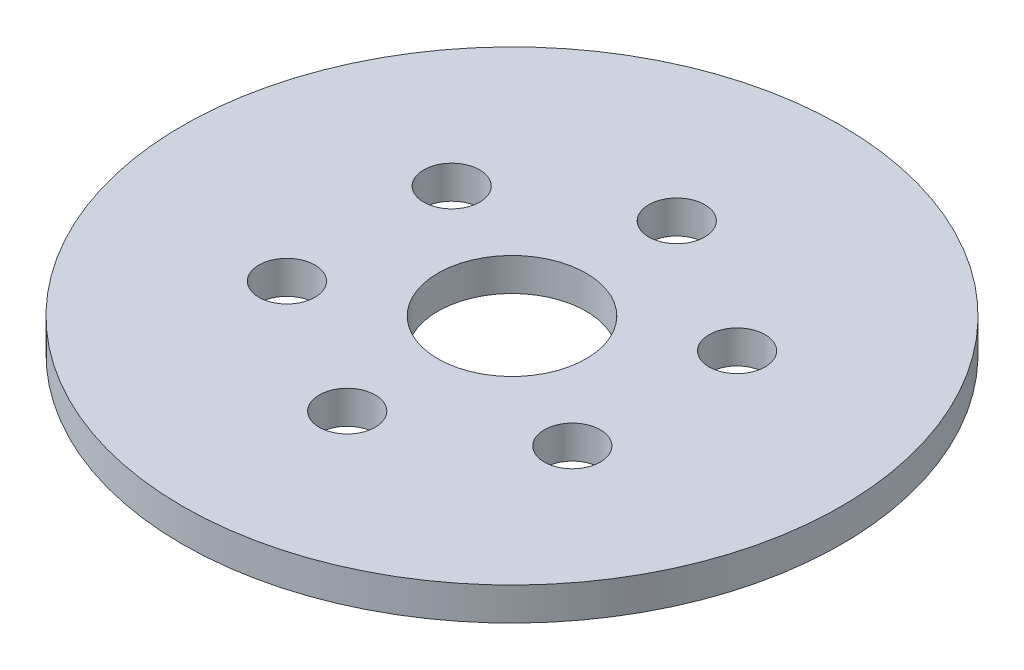
ISO-10303-21;
HEADER;
FILE_DESCRIPTION(('STEP AP214'),'2;1');
FILE_NAME('part.step','',(''),(''),'','','');
FILE_SCHEMA(('AUTOMOTIVE_DESIGN { 1 0 10303 214 1 1 1 1 }'));
ENDSEC;
DATA;
#1=APPLICATION_CONTEXT('core data for automotive mechanical design processes');
#2=APPLICATION_PROTOCOL_DEFINITION('international standard','automotive_design',2000,#1);
#3=PRODUCT_CONTEXT('',#1,'mechanical');
#4=PRODUCT('Part','Part','',(#3));
#5=PRODUCT_RELATED_PRODUCT_CATEGORY('part','',(#4));
#6=PRODUCT_DEFINITION_FORMATION('','',#4);
#7=PRODUCT_DEFINITION_CONTEXT('part definition',#1,'design');
#8=PRODUCT_DEFINITION('design','',#6,#7);
#9=PRODUCT_DEFINITION_SHAPE('','',#8);
#10=(LENGTH_UNIT() NAMED_UNIT(*) SI_UNIT(.MILLI.,.METRE.));
#11=(NAMED_UNIT(*) PLANE_ANGLE_UNIT() SI_UNIT($,.RADIAN.));
#12=(NAMED_UNIT(*) SI_UNIT($,.STERADIAN.) SOLID_ANGLE_UNIT());
#13=UNCERTAINTY_MEASURE_WITH_UNIT(LENGTH_MEASURE(1.E-05),#10,'distance_accuracy_value','');
#14=(GEOMETRIC_REPRESENTATION_CONTEXT(3) GLOBAL_UNCERTAINTY_ASSIGNED_CONTEXT((#13)) GLOBAL_UNIT_ASSIGNED_CONTEXT((#10,
#11,#12)) REPRESENTATION_CONTEXT('',''));
#15=CARTESIAN_POINT('',(0.,0.,0.));
#16=DIRECTION('',(0.,0.,1.));
#17=DIRECTION('',(1.,0.,0.));
#18=AXIS2_PLACEMENT_3D('',#15,#16,#17);
#19=CARTESIAN_POINT('',(0.,2.,0.));
#20=DIRECTION('',(0.,1.,0.));
#21=DIRECTION('',(0.,0.,1.));
#22=AXIS2_PLACEMENT_3D('',#19,#20,#21);
#23=PLANE('',#22);
#24=CARTESIAN_POINT('',(0.,2.,-10.));
#25=DIRECTION('',(0.,1.,0.));
#26=DIRECTION('',(0.,0.,1.));
#27=AXIS2_PLACEMENT_3D('',#24,#25,#26);
#28=CIRCLE('',#27,1.7);
#29=CARTESIAN_POINT('',(0.,2.,-8.3));
#30=VERTEX_POINT('',#29);
#31=EDGE_CURVE('E76',#30,#30,#28,.T.);
#32=ORIENTED_EDGE('',*,*,#31,.F.);
#33=EDGE_LOOP('',(#32));
#34=FACE_BOUND('',#33,.T.);
#35=CARTESIAN_POINT('',(-8.66025403784433,2.,-5.0000000000001));
#36=DIRECTION('',(0.,1.,0.));
#37=DIRECTION('',(0.,0.,1.));
#38=AXIS2_PLACEMENT_3D('',#35,#36,#37);
#39=CIRCLE('',#38,1.7);
#40=CARTESIAN_POINT('',(-8.66025403784433,2.,-3.3000000000001));
#41=VERTEX_POINT('',#40);
#42=EDGE_CURVE('E77',#41,#41,#39,.T.);
#43=ORIENTED_EDGE('',*,*,#42,.F.);
#44=EDGE_LOOP('',(#43));
#45=FACE_BOUND('',#44,.T.);
#46=CARTESIAN_POINT('',(-8.66025403784443,2.,4.99999999999992));
#47=DIRECTION('',(0.,1.,0.));
#48=DIRECTION('',(0.,0.,1.));
#49=AXIS2_PLACEMENT_3D('',#46,#47,#48);
#50=CIRCLE('',#49,1.7);
#51=CARTESIAN_POINT('',(-8.66025403784443,2.,6.69999999999992));
#52=VERTEX_POINT('',#51);
#53=EDGE_CURVE('E51',#52,#52,#50,.T.);
#54=ORIENTED_EDGE('',*,*,#53,.F.);
#55=EDGE_LOOP('',(#54));
#56=FACE_BOUND('',#55,.T.);
#57=CARTESIAN_POINT('',(0.,2.,10.));
#58=DIRECTION('',(0.,1.,0.));
#59=DIRECTION('',(0.,0.,1.));
#60=AXIS2_PLACEMENT_3D('',#57,#58,#59);
#61=CIRCLE('',#60,1.7);
#62=CARTESIAN_POINT('',(0.,2.,11.7));
#63=VERTEX_POINT('',#62);
#64=EDGE_CURVE('E58',#63,#63,#61,.T.);
#65=ORIENTED_EDGE('',*,*,#64,.F.);
#66=EDGE_LOOP('',(#65));
#67=FACE_BOUND('',#66,.T.);
#68=CARTESIAN_POINT('',(8.66025403784437,2.,5.00000000000004));
#69=DIRECTION('',(0.,1.,0.));
#70=DIRECTION('',(0.,0.,1.));
#71=AXIS2_PLACEMENT_3D('',#68,#69,#70);
#72=CIRCLE('',#71,1.7);
#73=CARTESIAN_POINT('',(8.66025403784437,2.,6.70000000000004));
#74=VERTEX_POINT('',#73);
#75=EDGE_CURVE('E64',#74,#74,#72,.T.);
#76=ORIENTED_EDGE('',*,*,#75,.F.);
#77=EDGE_LOOP('',(#76));
#78=FACE_BOUND('',#77,.T.);
#79=CARTESIAN_POINT('',(8.6602540378444,2.,-4.99999999999998));
#80=DIRECTION('',(0.,1.,0.));
#81=DIRECTION('',(0.,0.,1.));
#82=AXIS2_PLACEMENT_3D('',#79,#80,#81);
#83=CIRCLE('',#82,1.7);
#84=CARTESIAN_POINT('',(8.6602540378444,2.,-3.29999999999998));
#85=VERTEX_POINT('',#84);
#86=EDGE_CURVE('E70',#85,#85,#83,.T.);
#87=ORIENTED_EDGE('',*,*,#86,.F.);
#88=EDGE_LOOP('',(#87));
#89=FACE_BOUND('',#88,.T.);
#90=CARTESIAN_POINT('',(0.,2.,0.));
#91=DIRECTION('',(0.,1.,0.));
#92=DIRECTION('',(0.,0.,1.));
#93=AXIS2_PLACEMENT_3D('',#90,#91,#92);
#94=CIRCLE('',#93,20.);
#95=CARTESIAN_POINT('',(0.,2.,20.));
#96=VERTEX_POINT('',#95);
#97=EDGE_CURVE('E10',#96,#96,#94,.T.);
#98=ORIENTED_EDGE('',*,*,#97,.T.);
#99=EDGE_LOOP('',(#98));
#100=FACE_BOUND('',#99,.T.);
#101=CARTESIAN_POINT('',(0.,2.,0.));
#102=DIRECTION('',(0.,1.,0.));
#103=DIRECTION('',(0.,0.,1.));
#104=AXIS2_PLACEMENT_3D('',#101,#102,#103);
#105=CIRCLE('',#104,4.5);
#106=CARTESIAN_POINT('',(0.,2.,4.5));
#107=VERTEX_POINT('',#106);
#108=EDGE_CURVE('E43',#107,#107,#105,.T.);
#109=ORIENTED_EDGE('',*,*,#108,.F.);
#110=EDGE_LOOP('',(#109));
#111=FACE_BOUND('',#110,.T.);
#112=ADVANCED_FACE('F32',(#34,#45,#56,#67,#78,#89,#100,#111),#23,.T.);
#113=CARTESIAN_POINT('',(0.,0.,0.));
#114=DIRECTION('',(0.,1.,0.));
#115=DIRECTION('',(0.,0.,1.));
#116=AXIS2_PLACEMENT_3D('',#113,#114,#115);
#117=PLANE('',#116);
#118=CARTESIAN_POINT('',(0.,0.,-10.));
#119=DIRECTION('',(0.,1.,0.));
#120=DIRECTION('',(0.,0.,1.));
#121=AXIS2_PLACEMENT_3D('',#118,#119,#120);
#122=CIRCLE('',#121,1.7);
#123=CARTESIAN_POINT('',(0.,0.,-8.3));
#124=VERTEX_POINT('',#123);
#125=EDGE_CURVE('E48',#124,#124,#122,.T.);
#126=ORIENTED_EDGE('',*,*,#125,.T.);
#127=EDGE_LOOP('',(#126));
#128=FACE_BOUND('',#127,.T.);
#129=CARTESIAN_POINT('',(-8.66025403784433,0.,-5.0000000000001));
#130=DIRECTION('',(0.,1.,0.));
#131=DIRECTION('',(0.,0.,1.));
#132=AXIS2_PLACEMENT_3D('',#129,#130,#131);
#133=CIRCLE('',#132,1.7);
#134=CARTESIAN_POINT('',(-8.66025403784433,0.,-3.3000000000001));
#135=VERTEX_POINT('',#134);
#136=EDGE_CURVE('E55',#135,#135,#133,.T.);
#137=ORIENTED_EDGE('',*,*,#136,.T.);
#138=EDGE_LOOP('',(#137));
#139=FACE_BOUND('',#138,.T.);
#140=CARTESIAN_POINT('',(-8.66025403784443,0.,4.99999999999992));
#141=DIRECTION('',(0.,1.,0.));
#142=DIRECTION('',(0.,0.,1.));
#143=AXIS2_PLACEMENT_3D('',#140,#141,#142);
#144=CIRCLE('',#143,1.7);
#145=CARTESIAN_POINT('',(-8.66025403784443,0.,6.69999999999992));
#146=VERTEX_POINT('',#145);
#147=EDGE_CURVE('E54',#146,#146,#144,.T.);
#148=ORIENTED_EDGE('',*,*,#147,.T.);
#149=EDGE_LOOP('',(#148));
#150=FACE_BOUND('',#149,.T.);
#151=CARTESIAN_POINT('',(0.,0.,10.));
#152=DIRECTION('',(0.,1.,0.));
#153=DIRECTION('',(0.,0.,1.));
#154=AXIS2_PLACEMENT_3D('',#151,#152,#153);
#155=CIRCLE('',#154,1.7);
#156=CARTESIAN_POINT('',(0.,0.,11.7));
#157=VERTEX_POINT('',#156);
#158=EDGE_CURVE('E61',#157,#157,#155,.T.);
#159=ORIENTED_EDGE('',*,*,#158,.T.);
#160=EDGE_LOOP('',(#159));
#161=FACE_BOUND('',#160,.T.);
#162=CARTESIAN_POINT('',(8.66025403784437,0.,5.00000000000004));
#163=DIRECTION('',(0.,1.,0.));
#164=DIRECTION('',(0.,0.,1.));
#165=AXIS2_PLACEMENT_3D('',#162,#163,#164);
#166=CIRCLE('',#165,1.7);
#167=CARTESIAN_POINT('',(8.66025403784437,0.,6.70000000000004));
#168=VERTEX_POINT('',#167);
#169=EDGE_CURVE('E67',#168,#168,#166,.T.);
#170=ORIENTED_EDGE('',*,*,#169,.T.);
#171=EDGE_LOOP('',(#170));
#172=FACE_BOUND('',#171,.T.);
#173=CARTESIAN_POINT('',(8.6602540378444,0.,-4.99999999999998));
#174=DIRECTION('',(0.,1.,0.));
#175=DIRECTION('',(0.,0.,1.));
#176=AXIS2_PLACEMENT_3D('',#173,#174,#175);
#177=CIRCLE('',#176,1.7);
#178=CARTESIAN_POINT('',(8.6602540378444,0.,-3.29999999999998));
#179=VERTEX_POINT('',#178);
#180=EDGE_CURVE('E73',#179,#179,#177,.T.);
#181=ORIENTED_EDGE('',*,*,#180,.T.);
#182=EDGE_LOOP('',(#181));
#183=FACE_BOUND('',#182,.T.);
#184=CARTESIAN_POINT('',(0.,0.,0.));
#185=DIRECTION('',(0.,1.,0.));
#186=DIRECTION('',(0.,0.,1.));
#187=AXIS2_PLACEMENT_3D('',#184,#185,#186);
#188=CIRCLE('',#187,20.);
#189=CARTESIAN_POINT('',(0.,0.,20.));
#190=VERTEX_POINT('',#189);
#191=EDGE_CURVE('E36',#190,#190,#188,.T.);
#192=ORIENTED_EDGE('',*,*,#191,.F.);
#193=EDGE_LOOP('',(#192));
#194=FACE_BOUND('',#193,.T.);
#195=CARTESIAN_POINT('',(0.,0.,0.));
#196=DIRECTION('',(0.,1.,0.));
#197=DIRECTION('',(0.,0.,1.));
#198=AXIS2_PLACEMENT_3D('',#195,#196,#197);
#199=CIRCLE('',#198,4.5);
#200=CARTESIAN_POINT('',(0.,0.,4.5));
#201=VERTEX_POINT('',#200);
#202=EDGE_CURVE('E45',#201,#201,#199,.T.);
#203=ORIENTED_EDGE('',*,*,#202,.T.);
#204=EDGE_LOOP('',(#203));
#205=FACE_BOUND('',#204,.T.);
#206=ADVANCED_FACE('F87',(#128,#139,#150,#161,#172,#183,#194,#205),#117,.F.);
#207=CARTESIAN_POINT('',(0.,2.,0.));
#208=DIRECTION('',(0.,-1.,0.));
#209=DIRECTION('',(0.,0.,-1.));
#210=AXIS2_PLACEMENT_3D('',#207,#208,#209);
#211=CYLINDRICAL_SURFACE('',#210,20.);
#212=ORIENTED_EDGE('',*,*,#97,.F.);
#213=EDGE_LOOP('',(#212));
#214=FACE_BOUND('',#213,.T.);
#215=ORIENTED_EDGE('',*,*,#191,.T.);
#216=EDGE_LOOP('',(#215));
#217=FACE_BOUND('',#216,.T.);
#218=ADVANCED_FACE('F34',(#214,#217),#211,.T.);
#219=CARTESIAN_POINT('',(0.,2.,0.));
#220=DIRECTION('',(0.,-1.,0.));
#221=DIRECTION('',(0.,0.,-1.));
#222=AXIS2_PLACEMENT_3D('',#219,#220,#221);
#223=CYLINDRICAL_SURFACE('',#222,4.5);
#224=ORIENTED_EDGE('',*,*,#108,.T.);
#225=EDGE_LOOP('',(#224));
#226=FACE_BOUND('',#225,.T.);
#227=ORIENTED_EDGE('',*,*,#202,.F.);
#228=EDGE_LOOP('',(#227));
#229=FACE_BOUND('',#228,.T.);
#230=ADVANCED_FACE('F112',(#226,#229),#223,.F.);
#231=CARTESIAN_POINT('',(8.6602540378444,0.,-4.99999999999998));
#232=DIRECTION('',(0.,1.,0.));
#233=DIRECTION('',(0.,0.,1.));
#234=AXIS2_PLACEMENT_3D('',#231,#232,#233);
#235=CYLINDRICAL_SURFACE('',#234,1.7);
#236=ORIENTED_EDGE('',*,*,#180,.F.);
#237=EDGE_LOOP('',(#236));
#238=FACE_BOUND('',#237,.T.);
#239=ORIENTED_EDGE('',*,*,#86,.T.);
#240=EDGE_LOOP('',(#239));
#241=FACE_BOUND('',#240,.T.);
#242=ADVANCED_FACE('F115',(#238,#241),#235,.F.);
#243=CARTESIAN_POINT('',(8.66025403784437,0.,5.00000000000004));
#244=DIRECTION('',(0.,1.,0.));
#245=DIRECTION('',(0.,0.,1.));
#246=AXIS2_PLACEMENT_3D('',#243,#244,#245);
#247=CYLINDRICAL_SURFACE('',#246,1.7);
#248=ORIENTED_EDGE('',*,*,#169,.F.);
#249=EDGE_LOOP('',(#248));
#250=FACE_BOUND('',#249,.T.);
#251=ORIENTED_EDGE('',*,*,#75,.T.);
#252=EDGE_LOOP('',(#251));
#253=FACE_BOUND('',#252,.T.);
#254=ADVANCED_FACE('F132',(#250,#253),#247,.F.);
#255=CARTESIAN_POINT('',(0.,0.,10.));
#256=DIRECTION('',(0.,1.,0.));
#257=DIRECTION('',(0.,0.,1.));
#258=AXIS2_PLACEMENT_3D('',#255,#256,#257);
#259=CYLINDRICAL_SURFACE('',#258,1.7);
#260=ORIENTED_EDGE('',*,*,#158,.F.);
#261=EDGE_LOOP('',(#260));
#262=FACE_BOUND('',#261,.T.);
#263=ORIENTED_EDGE('',*,*,#64,.T.);
#264=EDGE_LOOP('',(#263));
#265=FACE_BOUND('',#264,.T.);
#266=ADVANCED_FACE('F128',(#262,#265),#259,.F.);
#267=CARTESIAN_POINT('',(-8.66025403784443,0.,4.99999999999992));
#268=DIRECTION('',(0.,1.,0.));
#269=DIRECTION('',(0.,0.,1.));
#270=AXIS2_PLACEMENT_3D('',#267,#268,#269);
#271=CYLINDRICAL_SURFACE('',#270,1.7);
#272=ORIENTED_EDGE('',*,*,#147,.F.);
#273=EDGE_LOOP('',(#272));
#274=FACE_BOUND('',#273,.T.);
#275=ORIENTED_EDGE('',*,*,#53,.T.);
#276=EDGE_LOOP('',(#275));
#277=FACE_BOUND('',#276,.T.);
#278=ADVANCED_FACE('F125',(#274,#277),#271,.F.);
#279=CARTESIAN_POINT('',(-8.66025403784433,0.,-5.0000000000001));
#280=DIRECTION('',(0.,1.,0.));
#281=DIRECTION('',(0.,0.,1.));
#282=AXIS2_PLACEMENT_3D('',#279,#280,#281);
#283=CYLINDRICAL_SURFACE('',#282,1.7);
#284=ORIENTED_EDGE('',*,*,#136,.F.);
#285=EDGE_LOOP('',(#284));
#286=FACE_BOUND('',#285,.T.);
#287=ORIENTED_EDGE('',*,*,#42,.T.);
#288=EDGE_LOOP('',(#287));
#289=FACE_BOUND('',#288,.T.);
#290=ADVANCED_FACE('F93',(#286,#289),#283,.F.);
#291=CARTESIAN_POINT('',(0.,0.,-10.));
#292=DIRECTION('',(0.,1.,0.));
#293=DIRECTION('',(0.,0.,1.));
#294=AXIS2_PLACEMENT_3D('',#291,#292,#293);
#295=CYLINDRICAL_SURFACE('',#294,1.7);
#296=ORIENTED_EDGE('',*,*,#125,.F.);
#297=EDGE_LOOP('',(#296));
#298=FACE_BOUND('',#297,.T.);
#299=ORIENTED_EDGE('',*,*,#31,.T.);
#300=EDGE_LOOP('',(#299));
#301=FACE_BOUND('',#300,.T.);
#302=ADVANCED_FACE('F90',(#298,#301),#295,.F.);
#303=CLOSED_SHELL('',(#112,#206,#218,#230,#242,#254,#266,#278,#290,#302));
#304=MANIFOLD_SOLID_BREP('B2',#303);
#305=ADVANCED_BREP_SHAPE_REPRESENTATION('',(#18,#304),#14);
#306=SHAPE_DEFINITION_REPRESENTATION(#9,#305);
ENDSEC;
END-ISO-10303-21;
